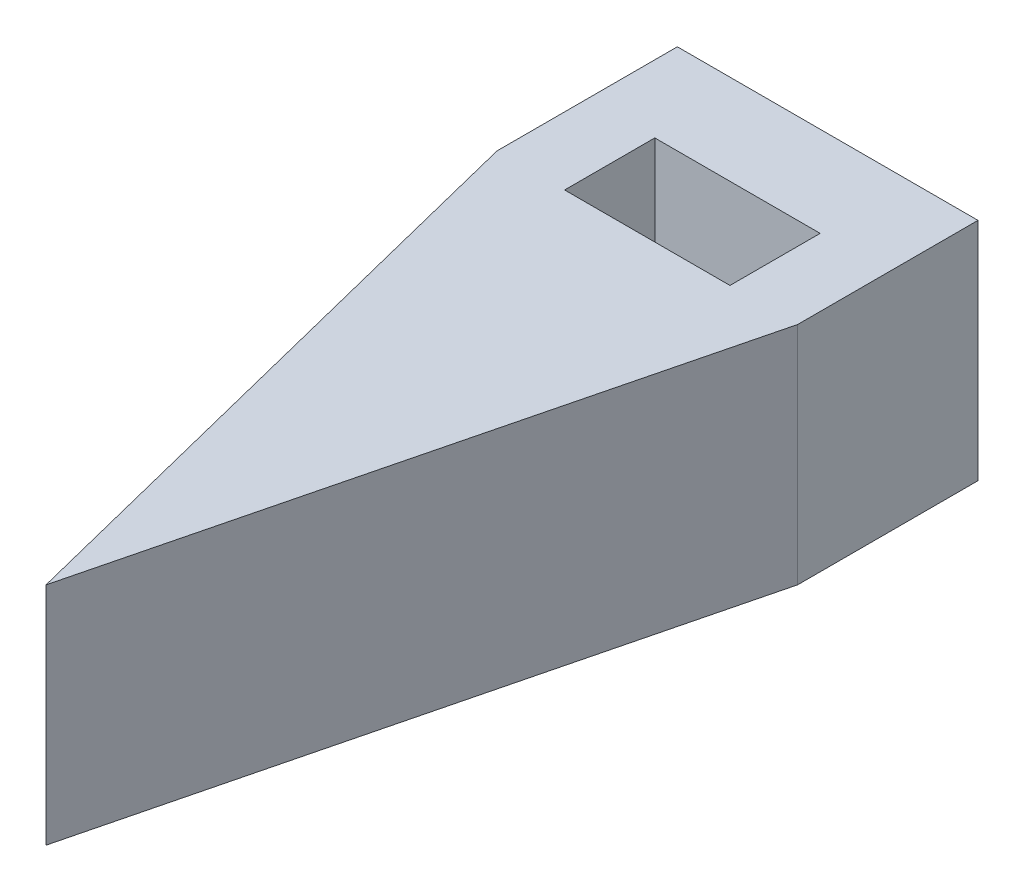
ISO-10303-21;
HEADER;
FILE_DESCRIPTION(('STEP AP214'),'2;1');
FILE_NAME('part.step','',(''),(''),'','','');
FILE_SCHEMA(('AUTOMOTIVE_DESIGN { 1 0 10303 214 1 1 1 1 }'));
ENDSEC;
DATA;
#1=APPLICATION_CONTEXT('core data for automotive mechanical design processes');
#2=APPLICATION_PROTOCOL_DEFINITION('international standard','automotive_design',2000,#1);
#3=PRODUCT_CONTEXT('',#1,'mechanical');
#4=PRODUCT('Part','Part','',(#3));
#5=PRODUCT_RELATED_PRODUCT_CATEGORY('part','',(#4));
#6=PRODUCT_DEFINITION_FORMATION('','',#4);
#7=PRODUCT_DEFINITION_CONTEXT('part definition',#1,'design');
#8=PRODUCT_DEFINITION('design','',#6,#7);
#9=PRODUCT_DEFINITION_SHAPE('','',#8);
#10=(LENGTH_UNIT() NAMED_UNIT(*) SI_UNIT(.MILLI.,.METRE.));
#11=(NAMED_UNIT(*) PLANE_ANGLE_UNIT() SI_UNIT($,.RADIAN.));
#12=(NAMED_UNIT(*) SI_UNIT($,.STERADIAN.) SOLID_ANGLE_UNIT());
#13=UNCERTAINTY_MEASURE_WITH_UNIT(LENGTH_MEASURE(1.E-05),#10,'distance_accuracy_value','');
#14=(GEOMETRIC_REPRESENTATION_CONTEXT(3) GLOBAL_UNCERTAINTY_ASSIGNED_CONTEXT((#13)) GLOBAL_UNIT_ASSIGNED_CONTEXT((#10,
#11,#12)) REPRESENTATION_CONTEXT('',''));
#15=CARTESIAN_POINT('',(0.,0.,0.));
#16=DIRECTION('',(0.,0.,1.));
#17=DIRECTION('',(1.,0.,0.));
#18=AXIS2_PLACEMENT_3D('',#15,#16,#17);
#19=CARTESIAN_POINT('',(0.,3.75,0.));
#20=DIRECTION('',(0.,1.,0.));
#21=DIRECTION('',(0.,0.,1.));
#22=AXIS2_PLACEMENT_3D('',#19,#20,#21);
#23=PLANE('',#22);
#24=DIRECTION('',(0.,0.,1.));
#25=VECTOR('',#24,1.);
#26=CARTESIAN_POINT('',(-5.,3.75,0.));
#27=LINE('',#26,#25);
#28=CARTESIAN_POINT('',(-5.,3.75,0.));
#29=VERTEX_POINT('',#28);
#30=CARTESIAN_POINT('',(-5.,3.75,6.));
#31=VERTEX_POINT('',#30);
#32=EDGE_CURVE('E153',#29,#31,#27,.T.);
#33=ORIENTED_EDGE('',*,*,#32,.T.);
#34=DIRECTION('',(0.242535625036333,0.,0.970142500145332));
#35=VECTOR('',#34,1.);
#36=CARTESIAN_POINT('',(-5.,3.75,6.));
#37=LINE('',#36,#35);
#38=CARTESIAN_POINT('',(0.,3.75,26.));
#39=VERTEX_POINT('',#38);
#40=EDGE_CURVE('E156',#31,#39,#37,.T.);
#41=ORIENTED_EDGE('',*,*,#40,.T.);
#42=DIRECTION('',(0.242535625036333,0.,-0.970142500145332));
#43=VECTOR('',#42,1.);
#44=CARTESIAN_POINT('',(5.,3.75,6.));
#45=LINE('',#44,#43);
#46=CARTESIAN_POINT('',(5.,3.75,6.));
#47=VERTEX_POINT('',#46);
#48=EDGE_CURVE('E159',#39,#47,#45,.T.);
#49=ORIENTED_EDGE('',*,*,#48,.T.);
#50=DIRECTION('',(0.,0.,-1.));
#51=VECTOR('',#50,1.);
#52=CARTESIAN_POINT('',(5.,3.75,0.));
#53=LINE('',#52,#51);
#54=CARTESIAN_POINT('',(5.,3.75,0.));
#55=VERTEX_POINT('',#54);
#56=EDGE_CURVE('E162',#47,#55,#53,.T.);
#57=ORIENTED_EDGE('',*,*,#56,.T.);
#58=DIRECTION('',(-1.,0.,0.));
#59=VECTOR('',#58,1.);
#60=CARTESIAN_POINT('',(-5.,3.75,0.));
#61=LINE('',#60,#59);
#62=EDGE_CURVE('E164',#55,#29,#61,.T.);
#63=ORIENTED_EDGE('',*,*,#62,.T.);
#64=EDGE_LOOP('',(#33,#41,#49,#57,#63));
#65=FACE_BOUND('',#64,.T.);
#66=DIRECTION('',(1.,0.,0.));
#67=VECTOR('',#66,1.);
#68=CARTESIAN_POINT('',(-2.75,3.75,6.));
#69=LINE('',#68,#67);
#70=CARTESIAN_POINT('',(-2.75,3.75,6.));
#71=VERTEX_POINT('',#70);
#72=CARTESIAN_POINT('',(2.75,3.75,6.));
#73=VERTEX_POINT('',#72);
#74=EDGE_CURVE('E123',#71,#73,#69,.T.);
#75=ORIENTED_EDGE('',*,*,#74,.F.);
#76=DIRECTION('',(0.,0.,1.));
#77=VECTOR('',#76,1.);
#78=CARTESIAN_POINT('',(-2.75,3.75,3.));
#79=LINE('',#78,#77);
#80=CARTESIAN_POINT('',(-2.75,3.75,3.));
#81=VERTEX_POINT('',#80);
#82=EDGE_CURVE('E115',#81,#71,#79,.T.);
#83=ORIENTED_EDGE('',*,*,#82,.F.);
#84=DIRECTION('',(-1.,0.,0.));
#85=VECTOR('',#84,1.);
#86=CARTESIAN_POINT('',(-2.75,3.75,3.));
#87=LINE('',#86,#85);
#88=CARTESIAN_POINT('',(2.75,3.75,3.));
#89=VERTEX_POINT('',#88);
#90=EDGE_CURVE('E137',#89,#81,#87,.T.);
#91=ORIENTED_EDGE('',*,*,#90,.F.);
#92=DIRECTION('',(0.,0.,-1.));
#93=VECTOR('',#92,1.);
#94=CARTESIAN_POINT('',(2.75,3.75,3.));
#95=LINE('',#94,#93);
#96=EDGE_CURVE('E135',#73,#89,#95,.T.);
#97=ORIENTED_EDGE('',*,*,#96,.F.);
#98=EDGE_LOOP('',(#75,#83,#91,#97));
#99=FACE_BOUND('',#98,.T.);
#100=ADVANCED_FACE('F44',(#65,#99),#23,.T.);
#101=CARTESIAN_POINT('',(0.,-3.75,0.));
#102=DIRECTION('',(0.,1.,0.));
#103=DIRECTION('',(0.,0.,1.));
#104=AXIS2_PLACEMENT_3D('',#101,#102,#103);
#105=PLANE('',#104);
#106=DIRECTION('',(0.,0.,1.));
#107=VECTOR('',#106,1.);
#108=CARTESIAN_POINT('',(-5.,-3.75,0.));
#109=LINE('',#108,#107);
#110=CARTESIAN_POINT('',(-5.,-3.75,0.));
#111=VERTEX_POINT('',#110);
#112=CARTESIAN_POINT('',(-5.,-3.75,6.));
#113=VERTEX_POINT('',#112);
#114=EDGE_CURVE('E131',#111,#113,#109,.T.);
#115=ORIENTED_EDGE('',*,*,#114,.F.);
#116=DIRECTION('',(-1.,0.,0.));
#117=VECTOR('',#116,1.);
#118=CARTESIAN_POINT('',(-5.,-3.75,0.));
#119=LINE('',#118,#117);
#120=CARTESIAN_POINT('',(5.,-3.75,0.));
#121=VERTEX_POINT('',#120);
#122=EDGE_CURVE('E157',#121,#111,#119,.T.);
#123=ORIENTED_EDGE('',*,*,#122,.F.);
#124=DIRECTION('',(0.,0.,-1.));
#125=VECTOR('',#124,1.);
#126=CARTESIAN_POINT('',(5.,-3.75,0.));
#127=LINE('',#126,#125);
#128=CARTESIAN_POINT('',(5.,-3.75,6.));
#129=VERTEX_POINT('',#128);
#130=EDGE_CURVE('E175',#129,#121,#127,.T.);
#131=ORIENTED_EDGE('',*,*,#130,.F.);
#132=DIRECTION('',(0.242535625036333,0.,-0.970142500145332));
#133=VECTOR('',#132,1.);
#134=CARTESIAN_POINT('',(5.,-3.75,6.));
#135=LINE('',#134,#133);
#136=CARTESIAN_POINT('',(0.,-3.75,26.));
#137=VERTEX_POINT('',#136);
#138=EDGE_CURVE('E172',#137,#129,#135,.T.);
#139=ORIENTED_EDGE('',*,*,#138,.F.);
#140=DIRECTION('',(0.242535625036333,0.,0.970142500145332));
#141=VECTOR('',#140,1.);
#142=CARTESIAN_POINT('',(-5.,-3.75,6.));
#143=LINE('',#142,#141);
#144=EDGE_CURVE('E170',#113,#137,#143,.T.);
#145=ORIENTED_EDGE('',*,*,#144,.F.);
#146=EDGE_LOOP('',(#115,#123,#131,#139,#145));
#147=FACE_BOUND('',#146,.T.);
#148=DIRECTION('',(0.,0.,1.));
#149=VECTOR('',#148,1.);
#150=CARTESIAN_POINT('',(-2.75,-3.75,3.));
#151=LINE('',#150,#149);
#152=CARTESIAN_POINT('',(-2.75,-3.75,3.));
#153=VERTEX_POINT('',#152);
#154=CARTESIAN_POINT('',(-2.75,-3.75,6.));
#155=VERTEX_POINT('',#154);
#156=EDGE_CURVE('E67',#153,#155,#151,.T.);
#157=ORIENTED_EDGE('',*,*,#156,.T.);
#158=DIRECTION('',(1.,0.,0.));
#159=VECTOR('',#158,1.);
#160=CARTESIAN_POINT('',(-2.75,-3.75,6.));
#161=LINE('',#160,#159);
#162=CARTESIAN_POINT('',(2.75,-3.75,6.));
#163=VERTEX_POINT('',#162);
#164=EDGE_CURVE('E130',#155,#163,#161,.T.);
#165=ORIENTED_EDGE('',*,*,#164,.T.);
#166=DIRECTION('',(0.,0.,-1.));
#167=VECTOR('',#166,1.);
#168=CARTESIAN_POINT('',(2.75,-3.75,3.));
#169=LINE('',#168,#167);
#170=CARTESIAN_POINT('',(2.75,-3.75,3.));
#171=VERTEX_POINT('',#170);
#172=EDGE_CURVE('E144',#163,#171,#169,.T.);
#173=ORIENTED_EDGE('',*,*,#172,.T.);
#174=DIRECTION('',(-1.,0.,0.));
#175=VECTOR('',#174,1.);
#176=CARTESIAN_POINT('',(-2.75,-3.75,3.));
#177=LINE('',#176,#175);
#178=EDGE_CURVE('E124',#171,#153,#177,.T.);
#179=ORIENTED_EDGE('',*,*,#178,.T.);
#180=EDGE_LOOP('',(#157,#165,#173,#179));
#181=FACE_BOUND('',#180,.T.);
#182=ADVANCED_FACE('F197',(#147,#181),#105,.F.);
#183=CARTESIAN_POINT('',(-5.,3.75,0.));
#184=DIRECTION('',(1.,0.,0.));
#185=DIRECTION('',(0.,0.,-1.));
#186=AXIS2_PLACEMENT_3D('',#183,#184,#185);
#187=PLANE('',#186);
#188=ORIENTED_EDGE('',*,*,#114,.T.);
#189=DIRECTION('',(0.,-1.,0.));
#190=VECTOR('',#189,1.);
#191=CARTESIAN_POINT('',(-5.,3.75,6.));
#192=LINE('',#191,#190);
#193=EDGE_CURVE('E11',#31,#113,#192,.T.);
#194=ORIENTED_EDGE('',*,*,#193,.F.);
#195=ORIENTED_EDGE('',*,*,#32,.F.);
#196=DIRECTION('',(0.,-1.,0.));
#197=VECTOR('',#196,1.);
#198=CARTESIAN_POINT('',(-5.,3.75,0.));
#199=LINE('',#198,#197);
#200=EDGE_CURVE('E167',#29,#111,#199,.T.);
#201=ORIENTED_EDGE('',*,*,#200,.T.);
#202=EDGE_LOOP('',(#188,#194,#195,#201));
#203=FACE_BOUND('',#202,.T.);
#204=ADVANCED_FACE('F46',(#203),#187,.F.);
#205=CARTESIAN_POINT('',(-5.,3.75,6.));
#206=DIRECTION('',(0.970142500145332,0.,-0.242535625036333));
#207=DIRECTION('',(-0.242535625036333,0.,-0.970142500145332));
#208=AXIS2_PLACEMENT_3D('',#205,#206,#207);
#209=PLANE('',#208);
#210=ORIENTED_EDGE('',*,*,#144,.T.);
#211=DIRECTION('',(0.,-1.,0.));
#212=VECTOR('',#211,1.);
#213=CARTESIAN_POINT('',(0.,3.75,26.));
#214=LINE('',#213,#212);
#215=EDGE_CURVE('E52',#39,#137,#214,.T.);
#216=ORIENTED_EDGE('',*,*,#215,.F.);
#217=ORIENTED_EDGE('',*,*,#40,.F.);
#218=ORIENTED_EDGE('',*,*,#193,.T.);
#219=EDGE_LOOP('',(#210,#216,#217,#218));
#220=FACE_BOUND('',#219,.T.);
#221=ADVANCED_FACE('F211',(#220),#209,.F.);
#222=CARTESIAN_POINT('',(5.,3.75,6.));
#223=DIRECTION('',(-0.970142500145332,0.,-0.242535625036333));
#224=DIRECTION('',(-0.242535625036333,0.,0.970142500145332));
#225=AXIS2_PLACEMENT_3D('',#222,#223,#224);
#226=PLANE('',#225);
#227=ORIENTED_EDGE('',*,*,#138,.T.);
#228=DIRECTION('',(0.,-1.,0.));
#229=VECTOR('',#228,1.);
#230=CARTESIAN_POINT('',(5.,3.75,6.));
#231=LINE('',#230,#229);
#232=EDGE_CURVE('E184',#47,#129,#231,.T.);
#233=ORIENTED_EDGE('',*,*,#232,.F.);
#234=ORIENTED_EDGE('',*,*,#48,.F.);
#235=ORIENTED_EDGE('',*,*,#215,.T.);
#236=EDGE_LOOP('',(#227,#233,#234,#235));
#237=FACE_BOUND('',#236,.T.);
#238=ADVANCED_FACE('F191',(#237),#226,.F.);
#239=CARTESIAN_POINT('',(5.,3.75,0.));
#240=DIRECTION('',(-1.,0.,0.));
#241=DIRECTION('',(0.,0.,1.));
#242=AXIS2_PLACEMENT_3D('',#239,#240,#241);
#243=PLANE('',#242);
#244=ORIENTED_EDGE('',*,*,#130,.T.);
#245=DIRECTION('',(0.,-1.,0.));
#246=VECTOR('',#245,1.);
#247=CARTESIAN_POINT('',(5.,3.75,0.));
#248=LINE('',#247,#246);
#249=EDGE_CURVE('E181',#55,#121,#248,.T.);
#250=ORIENTED_EDGE('',*,*,#249,.F.);
#251=ORIENTED_EDGE('',*,*,#56,.F.);
#252=ORIENTED_EDGE('',*,*,#232,.T.);
#253=EDGE_LOOP('',(#244,#250,#251,#252));
#254=FACE_BOUND('',#253,.T.);
#255=ADVANCED_FACE('F202',(#254),#243,.F.);
#256=CARTESIAN_POINT('',(-5.,3.75,0.));
#257=DIRECTION('',(0.,0.,1.));
#258=DIRECTION('',(1.,0.,0.));
#259=AXIS2_PLACEMENT_3D('',#256,#257,#258);
#260=PLANE('',#259);
#261=ORIENTED_EDGE('',*,*,#122,.T.);
#262=ORIENTED_EDGE('',*,*,#200,.F.);
#263=ORIENTED_EDGE('',*,*,#62,.F.);
#264=ORIENTED_EDGE('',*,*,#249,.T.);
#265=EDGE_LOOP('',(#261,#262,#263,#264));
#266=FACE_BOUND('',#265,.T.);
#267=ADVANCED_FACE('F206',(#266),#260,.F.);
#268=CARTESIAN_POINT('',(-2.75,3.75,3.));
#269=DIRECTION('',(1.,0.,0.));
#270=DIRECTION('',(0.,0.,-1.));
#271=AXIS2_PLACEMENT_3D('',#268,#269,#270);
#272=PLANE('',#271);
#273=ORIENTED_EDGE('',*,*,#156,.F.);
#274=DIRECTION('',(0.,-1.,0.));
#275=VECTOR('',#274,1.);
#276=CARTESIAN_POINT('',(-2.75,3.75,3.));
#277=LINE('',#276,#275);
#278=EDGE_CURVE('E119',#81,#153,#277,.T.);
#279=ORIENTED_EDGE('',*,*,#278,.F.);
#280=ORIENTED_EDGE('',*,*,#82,.T.);
#281=DIRECTION('',(0.,-1.,0.));
#282=VECTOR('',#281,1.);
#283=CARTESIAN_POINT('',(-2.75,3.75,6.));
#284=LINE('',#283,#282);
#285=EDGE_CURVE('E118',#71,#155,#284,.T.);
#286=ORIENTED_EDGE('',*,*,#285,.T.);
#287=EDGE_LOOP('',(#273,#279,#280,#286));
#288=FACE_BOUND('',#287,.T.);
#289=ADVANCED_FACE('F117',(#288),#272,.T.);
#290=CARTESIAN_POINT('',(-2.75,3.75,6.));
#291=DIRECTION('',(0.,0.,-1.));
#292=DIRECTION('',(-1.,0.,0.));
#293=AXIS2_PLACEMENT_3D('',#290,#291,#292);
#294=PLANE('',#293);
#295=ORIENTED_EDGE('',*,*,#164,.F.);
#296=ORIENTED_EDGE('',*,*,#285,.F.);
#297=ORIENTED_EDGE('',*,*,#74,.T.);
#298=DIRECTION('',(0.,-1.,0.));
#299=VECTOR('',#298,1.);
#300=CARTESIAN_POINT('',(2.75,3.75,6.));
#301=LINE('',#300,#299);
#302=EDGE_CURVE('E132',#73,#163,#301,.T.);
#303=ORIENTED_EDGE('',*,*,#302,.T.);
#304=EDGE_LOOP('',(#295,#296,#297,#303));
#305=FACE_BOUND('',#304,.T.);
#306=ADVANCED_FACE('F127',(#305),#294,.T.);
#307=CARTESIAN_POINT('',(2.75,3.75,3.));
#308=DIRECTION('',(-1.,0.,0.));
#309=DIRECTION('',(0.,0.,1.));
#310=AXIS2_PLACEMENT_3D('',#307,#308,#309);
#311=PLANE('',#310);
#312=ORIENTED_EDGE('',*,*,#172,.F.);
#313=ORIENTED_EDGE('',*,*,#302,.F.);
#314=ORIENTED_EDGE('',*,*,#96,.T.);
#315=DIRECTION('',(0.,-1.,0.));
#316=VECTOR('',#315,1.);
#317=CARTESIAN_POINT('',(2.75,3.75,3.));
#318=LINE('',#317,#316);
#319=EDGE_CURVE('E59',#89,#171,#318,.T.);
#320=ORIENTED_EDGE('',*,*,#319,.T.);
#321=EDGE_LOOP('',(#312,#313,#314,#320));
#322=FACE_BOUND('',#321,.T.);
#323=ADVANCED_FACE('F258',(#322),#311,.T.);
#324=CARTESIAN_POINT('',(-2.75,3.75,3.));
#325=DIRECTION('',(0.,0.,1.));
#326=DIRECTION('',(1.,0.,0.));
#327=AXIS2_PLACEMENT_3D('',#324,#325,#326);
#328=PLANE('',#327);
#329=ORIENTED_EDGE('',*,*,#178,.F.);
#330=ORIENTED_EDGE('',*,*,#319,.F.);
#331=ORIENTED_EDGE('',*,*,#90,.T.);
#332=ORIENTED_EDGE('',*,*,#278,.T.);
#333=EDGE_LOOP('',(#329,#330,#331,#332));
#334=FACE_BOUND('',#333,.T.);
#335=ADVANCED_FACE('F265',(#334),#328,.T.);
#336=CLOSED_SHELL('',(#100,#182,#204,#221,#238,#255,#267,#289,#306,#323,#335));
#337=MANIFOLD_SOLID_BREP('B2',#336);
#338=ADVANCED_BREP_SHAPE_REPRESENTATION('',(#18,#337),#14);
#339=SHAPE_DEFINITION_REPRESENTATION(#9,#338);
ENDSEC;
END-ISO-10303-21;
